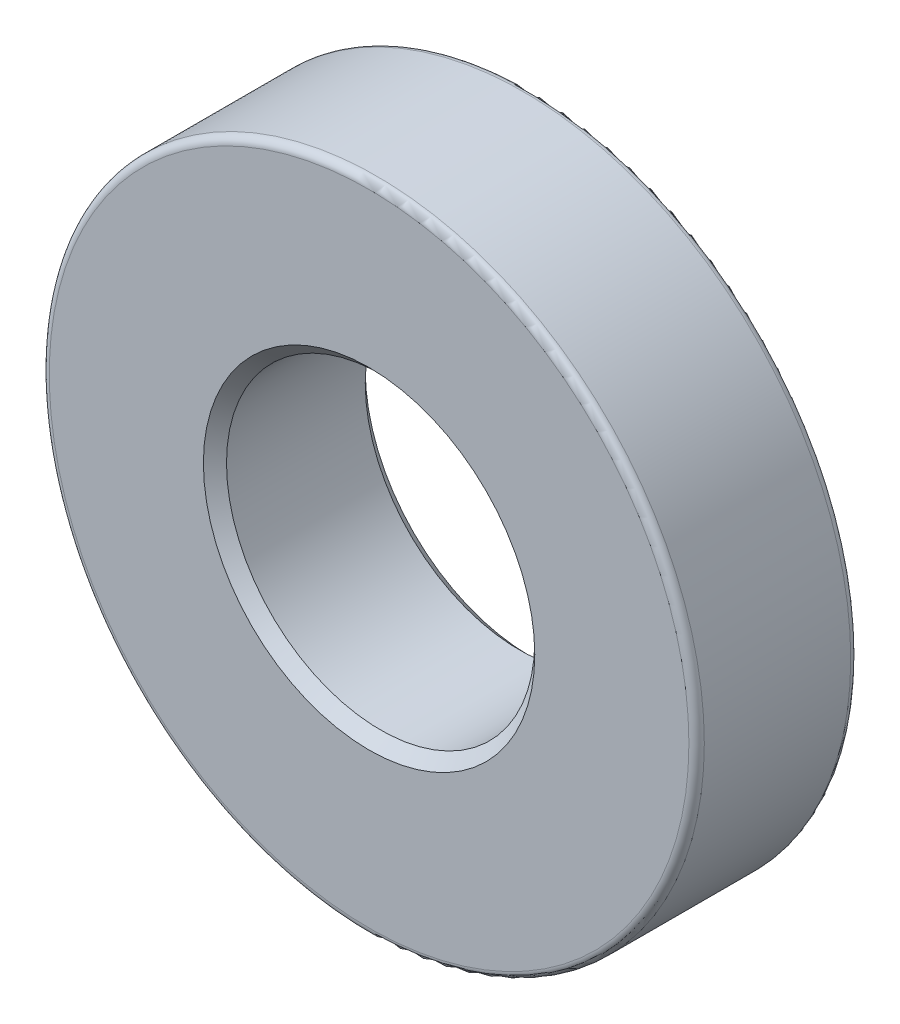
ISO-10303-21;
HEADER;
FILE_DESCRIPTION(('STEP AP214'),'2;1');
FILE_NAME('part.step','',(''),(''),'','','');
FILE_SCHEMA(('AUTOMOTIVE_DESIGN { 1 0 10303 214 1 1 1 1 }'));
ENDSEC;
DATA;
#1=APPLICATION_CONTEXT('core data for automotive mechanical design processes');
#2=APPLICATION_PROTOCOL_DEFINITION('international standard','automotive_design',2000,#1);
#3=PRODUCT_CONTEXT('',#1,'mechanical');
#4=PRODUCT('Part','Part','',(#3));
#5=PRODUCT_RELATED_PRODUCT_CATEGORY('part','',(#4));
#6=PRODUCT_DEFINITION_FORMATION('','',#4);
#7=PRODUCT_DEFINITION_CONTEXT('part definition',#1,'design');
#8=PRODUCT_DEFINITION('design','',#6,#7);
#9=PRODUCT_DEFINITION_SHAPE('','',#8);
#10=(LENGTH_UNIT() NAMED_UNIT(*) SI_UNIT(.MILLI.,.METRE.));
#11=(NAMED_UNIT(*) PLANE_ANGLE_UNIT() SI_UNIT($,.RADIAN.));
#12=(NAMED_UNIT(*) SI_UNIT($,.STERADIAN.) SOLID_ANGLE_UNIT());
#13=UNCERTAINTY_MEASURE_WITH_UNIT(LENGTH_MEASURE(1.E-05),#10,'distance_accuracy_value','');
#14=(GEOMETRIC_REPRESENTATION_CONTEXT(3) GLOBAL_UNCERTAINTY_ASSIGNED_CONTEXT((#13)) GLOBAL_UNIT_ASSIGNED_CONTEXT((#10,
#11,#12)) REPRESENTATION_CONTEXT('',''));
#15=CARTESIAN_POINT('',(0.,0.,0.));
#16=DIRECTION('',(0.,0.,1.));
#17=DIRECTION('',(1.,0.,0.));
#18=AXIS2_PLACEMENT_3D('',#15,#16,#17);
#19=CARTESIAN_POINT('',(0.,0.,4.2));
#20=DIRECTION('',(0.,0.,1.));
#21=DIRECTION('',(1.,0.,0.));
#22=AXIS2_PLACEMENT_3D('',#19,#20,#21);
#23=PLANE('',#22);
#24=CARTESIAN_POINT('',(0.,0.,4.2));
#25=DIRECTION('',(0.,0.,1.));
#26=DIRECTION('',(1.,0.,0.));
#27=AXIS2_PLACEMENT_3D('',#24,#25,#26);
#28=CIRCLE('',#27,8.3);
#29=CARTESIAN_POINT('',(8.3,0.,4.2));
#30=VERTEX_POINT('',#29);
#31=EDGE_CURVE('E10',#30,#30,#28,.T.);
#32=ORIENTED_EDGE('',*,*,#31,.T.);
#33=EDGE_LOOP('',(#32));
#34=FACE_BOUND('',#33,.T.);
#35=CARTESIAN_POINT('',(0.,0.,4.2));
#36=DIRECTION('',(0.,0.,1.));
#37=DIRECTION('',(1.,0.,0.));
#38=AXIS2_PLACEMENT_3D('',#35,#36,#37);
#39=CIRCLE('',#38,4.3);
#40=CARTESIAN_POINT('',(4.3,0.,4.2));
#41=VERTEX_POINT('',#40);
#42=EDGE_CURVE('E60',#41,#41,#39,.F.);
#43=ORIENTED_EDGE('',*,*,#42,.T.);
#44=EDGE_LOOP('',(#43));
#45=FACE_BOUND('',#44,.T.);
#46=ADVANCED_FACE('F37',(#34,#45),#23,.T.);
#47=CARTESIAN_POINT('',(0.,0.,0.));
#48=DIRECTION('',(0.,0.,1.));
#49=DIRECTION('',(1.,0.,0.));
#50=AXIS2_PLACEMENT_3D('',#47,#48,#49);
#51=PLANE('',#50);
#52=CARTESIAN_POINT('',(0.,0.,0.));
#53=DIRECTION('',(0.,0.,1.));
#54=DIRECTION('',(1.,0.,0.));
#55=AXIS2_PLACEMENT_3D('',#52,#53,#54);
#56=CIRCLE('',#55,8.3);
#57=CARTESIAN_POINT('',(8.3,0.,0.));
#58=VERTEX_POINT('',#57);
#59=EDGE_CURVE('E44',#58,#58,#56,.F.);
#60=ORIENTED_EDGE('',*,*,#59,.T.);
#61=EDGE_LOOP('',(#60));
#62=FACE_BOUND('',#61,.T.);
#63=CARTESIAN_POINT('',(0.,0.,0.));
#64=DIRECTION('',(0.,0.,1.));
#65=DIRECTION('',(1.,0.,0.));
#66=AXIS2_PLACEMENT_3D('',#63,#64,#65);
#67=CIRCLE('',#66,4.3);
#68=CARTESIAN_POINT('',(-4.3,0.,0.));
#69=VERTEX_POINT('',#68);
#70=EDGE_CURVE('E57',#69,#69,#67,.T.);
#71=ORIENTED_EDGE('',*,*,#70,.T.);
#72=EDGE_LOOP('',(#71));
#73=FACE_BOUND('',#72,.T.);
#74=ADVANCED_FACE('F80',(#62,#73),#51,.F.);
#75=CARTESIAN_POINT('',(0.,0.,4.2));
#76=DIRECTION('',(0.,0.,-1.));
#77=DIRECTION('',(-1.,0.,0.));
#78=AXIS2_PLACEMENT_3D('',#75,#76,#77);
#79=CYLINDRICAL_SURFACE('',#78,8.5);
#80=CARTESIAN_POINT('',(0.,0.,0.2));
#81=DIRECTION('',(0.,0.,1.));
#82=DIRECTION('',(1.,0.,0.));
#83=AXIS2_PLACEMENT_3D('',#80,#81,#82);
#84=CIRCLE('',#83,8.5);
#85=CARTESIAN_POINT('',(8.5,0.,0.2));
#86=VERTEX_POINT('',#85);
#87=EDGE_CURVE('E48',#86,#86,#84,.T.);
#88=ORIENTED_EDGE('',*,*,#87,.T.);
#89=EDGE_LOOP('',(#88));
#90=FACE_BOUND('',#89,.T.);
#91=CARTESIAN_POINT('',(0.,0.,4.));
#92=DIRECTION('',(0.,0.,1.));
#93=DIRECTION('',(1.,0.,0.));
#94=AXIS2_PLACEMENT_3D('',#91,#92,#93);
#95=CIRCLE('',#94,8.5);
#96=CARTESIAN_POINT('',(8.5,0.,4.));
#97=VERTEX_POINT('',#96);
#98=EDGE_CURVE('E52',#97,#97,#95,.F.);
#99=ORIENTED_EDGE('',*,*,#98,.T.);
#100=EDGE_LOOP('',(#99));
#101=FACE_BOUND('',#100,.T.);
#102=ADVANCED_FACE('F82',(#90,#101),#79,.T.);
#103=CARTESIAN_POINT('',(0.,0.,4.2));
#104=DIRECTION('',(0.,0.,-1.));
#105=DIRECTION('',(-1.,0.,0.));
#106=AXIS2_PLACEMENT_3D('',#103,#104,#105);
#107=CYLINDRICAL_SURFACE('',#106,4.);
#108=CARTESIAN_POINT('',(0.,0.,3.9));
#109=DIRECTION('',(0.,0.,1.));
#110=DIRECTION('',(1.,0.,0.));
#111=AXIS2_PLACEMENT_3D('',#108,#109,#110);
#112=CIRCLE('',#111,4.);
#113=CARTESIAN_POINT('',(4.,0.,3.9));
#114=VERTEX_POINT('',#113);
#115=EDGE_CURVE('E63',#114,#114,#112,.T.);
#116=ORIENTED_EDGE('',*,*,#115,.T.);
#117=EDGE_LOOP('',(#116));
#118=FACE_BOUND('',#117,.T.);
#119=CARTESIAN_POINT('',(0.,0.,0.300000000000005));
#120=DIRECTION('',(0.,0.,1.));
#121=DIRECTION('',(1.,0.,0.));
#122=AXIS2_PLACEMENT_3D('',#119,#120,#121);
#123=CIRCLE('',#122,4.);
#124=CARTESIAN_POINT('',(-4.,0.,0.300000000000005));
#125=VERTEX_POINT('',#124);
#126=EDGE_CURVE('E66',#125,#125,#123,.F.);
#127=ORIENTED_EDGE('',*,*,#126,.T.);
#128=EDGE_LOOP('',(#127));
#129=FACE_BOUND('',#128,.T.);
#130=ADVANCED_FACE('F70',(#118,#129),#107,.F.);
#131=CARTESIAN_POINT('',(0.,0.,3.9));
#132=DIRECTION('',(0.,0.,1.));
#133=DIRECTION('',(1.,0.,0.));
#134=AXIS2_PLACEMENT_3D('',#131,#132,#133);
#135=CONICAL_SURFACE('',#134,4.,0.785398163397445);
#136=ORIENTED_EDGE('',*,*,#42,.F.);
#137=EDGE_LOOP('',(#136));
#138=FACE_BOUND('',#137,.T.);
#139=ORIENTED_EDGE('',*,*,#115,.F.);
#140=EDGE_LOOP('',(#139));
#141=FACE_BOUND('',#140,.T.);
#142=ADVANCED_FACE('F76',(#138,#141),#135,.F.);
#143=CARTESIAN_POINT('',(0.,0.,0.));
#144=DIRECTION('',(0.,0.,-1.));
#145=DIRECTION('',(-1.,0.,0.));
#146=AXIS2_PLACEMENT_3D('',#143,#144,#145);
#147=CONICAL_SURFACE('',#146,4.3,0.785398163397445);
#148=CARTESIAN_POINT('',(-4.,0.,0.300000000000005));
#149=CARTESIAN_POINT('',(-4.003125,0.,0.296875000000005));
#150=CARTESIAN_POINT('',(-4.00625,0.,0.293750000000005));
#151=CARTESIAN_POINT('',(-4.0125,0.,0.287500000000005));
#152=CARTESIAN_POINT('',(-4.015625,0.,0.284375000000005));
#153=CARTESIAN_POINT('',(-4.021875,0.,0.278125000000005));
#154=CARTESIAN_POINT('',(-4.025,0.,0.275000000000005));
#155=CARTESIAN_POINT('',(-4.03125,0.,0.268750000000004));
#156=CARTESIAN_POINT('',(-4.034375,0.,0.265625000000004));
#157=CARTESIAN_POINT('',(-4.040625,0.,0.259375000000004));
#158=CARTESIAN_POINT('',(-4.04375,0.,0.256250000000004));
#159=CARTESIAN_POINT('',(-4.05,0.,0.250000000000004));
#160=CARTESIAN_POINT('',(-4.053125,0.,0.246875000000004));
#161=CARTESIAN_POINT('',(-4.059375,0.,0.240625000000004));
#162=CARTESIAN_POINT('',(-4.0625,0.,0.237500000000004));
#163=CARTESIAN_POINT('',(-4.06875,0.,0.231250000000004));
#164=CARTESIAN_POINT('',(-4.071875,0.,0.228125000000004));
#165=CARTESIAN_POINT('',(-4.078125,0.,0.221875000000004));
#166=CARTESIAN_POINT('',(-4.08125,0.,0.218750000000004));
#167=CARTESIAN_POINT('',(-4.0875,0.,0.212500000000004));
#168=CARTESIAN_POINT('',(-4.090625,0.,0.209375000000004));
#169=CARTESIAN_POINT('',(-4.096875,0.,0.203125000000003));
#170=CARTESIAN_POINT('',(-4.1,0.,0.200000000000003));
#171=CARTESIAN_POINT('',(-4.10625,0.,0.193750000000003));
#172=CARTESIAN_POINT('',(-4.109375,0.,0.190625000000003));
#173=CARTESIAN_POINT('',(-4.115625,0.,0.184375000000003));
#174=CARTESIAN_POINT('',(-4.11875,0.,0.181250000000003));
#175=CARTESIAN_POINT('',(-4.125,0.,0.175000000000003));
#176=CARTESIAN_POINT('',(-4.128125,0.,0.171875000000003));
#177=CARTESIAN_POINT('',(-4.134375,0.,0.165625000000003));
#178=CARTESIAN_POINT('',(-4.1375,0.,0.162500000000003));
#179=CARTESIAN_POINT('',(-4.14375,0.,0.156250000000003));
#180=CARTESIAN_POINT('',(-4.146875,0.,0.153125000000003));
#181=CARTESIAN_POINT('',(-4.153125,0.,0.146875000000002));
#182=CARTESIAN_POINT('',(-4.15625,0.,0.143750000000002));
#183=CARTESIAN_POINT('',(-4.1625,0.,0.137500000000002));
#184=CARTESIAN_POINT('',(-4.165625,0.,0.134375000000002));
#185=CARTESIAN_POINT('',(-4.171875,0.,0.128125000000002));
#186=CARTESIAN_POINT('',(-4.175,0.,0.125000000000002));
#187=CARTESIAN_POINT('',(-4.18125,0.,0.118750000000002));
#188=CARTESIAN_POINT('',(-4.184375,0.,0.115625000000002));
#189=CARTESIAN_POINT('',(-4.190625,0.,0.109375000000002));
#190=CARTESIAN_POINT('',(-4.19375,0.,0.106250000000002));
#191=CARTESIAN_POINT('',(-4.2,0.,0.100000000000002));
#192=CARTESIAN_POINT('',(-4.203125,0.,0.0968750000000017));
#193=CARTESIAN_POINT('',(-4.209375,0.,0.0906250000000015));
#194=CARTESIAN_POINT('',(-4.2125,0.,0.0875000000000014));
#195=CARTESIAN_POINT('',(-4.21875,0.,0.0812500000000013));
#196=CARTESIAN_POINT('',(-4.221875,0.,0.0781250000000014));
#197=CARTESIAN_POINT('',(-4.228125,0.,0.0718750000000013));
#198=CARTESIAN_POINT('',(-4.23125,0.,0.0687500000000012));
#199=CARTESIAN_POINT('',(-4.2375,0.,0.062500000000001));
#200=CARTESIAN_POINT('',(-4.240625,0.,0.059375000000001));
#201=CARTESIAN_POINT('',(-4.246875,0.,0.0531250000000009));
#202=CARTESIAN_POINT('',(-4.25,0.,0.0500000000000008));
#203=CARTESIAN_POINT('',(-4.25625,0.,0.0437500000000007));
#204=CARTESIAN_POINT('',(-4.259375,0.,0.0406250000000007));
#205=CARTESIAN_POINT('',(-4.265625,0.,0.0343750000000007));
#206=CARTESIAN_POINT('',(-4.26875,0.,0.0312500000000006));
#207=CARTESIAN_POINT('',(-4.275,0.,0.0250000000000004));
#208=CARTESIAN_POINT('',(-4.278125,0.,0.0218750000000003));
#209=CARTESIAN_POINT('',(-4.284375,0.,0.0156250000000002));
#210=CARTESIAN_POINT('',(-4.2875,0.,0.0125000000000002));
#211=CARTESIAN_POINT('',(-4.29375,0.,0.00625000000000024));
#212=CARTESIAN_POINT('',(-4.296875,0.,0.00312500000000025));
#213=CARTESIAN_POINT('',(-4.3,0.,0.));
#214=B_SPLINE_CURVE_WITH_KNOTS('',3,(#148,#149,#150,#151,#152,#153,#154,#155,#156,#157,#158,
#159,#160,#161,#162,#163,#164,#165,#166,#167,#168,#169,#170,#171,#172,#173,#174,#175,#176,#177,
#178,#179,#180,#181,#182,#183,#184,#185,#186,#187,#188,#189,#190,#191,#192,#193,#194,#195,#196,
#197,#198,#199,#200,#201,#202,#203,#204,#205,#206,#207,#208,#209,#210,#211,#212,#213),
.UNSPECIFIED.,.F.,.F.,(4,2,2,2,2,2,2,2,2,2,2,2,2,2,2,2,2,2,2,2,2,2,2,2,2,2,2,2,2,2,2,2,4),(0.,
0.0132582521472478,0.0265165042944961,0.0397747564417439,0.0530330085889917,0.06629126073624,
0.0795495128834878,0.0928077650307355,0.106066017177983,0.119324269325232,0.132582521472479,
0.145840773619727,0.159099025766976,0.172357277914223,0.185615530061471,0.198873782208719,
0.212132034355967,0.225390286503215,0.238648538650463,0.251906790797711,0.265165042944959,
0.278423295092207,0.291681547239455,0.304939799386703,0.318198051533951,0.331456303681199,
0.344714555828447,0.357972807975695,0.371231060122943,0.384489312270191,0.397747564417439,
0.411005816564687,0.424264068711935),.UNSPECIFIED.);
#215=EDGE_CURVE('BSEAM72',#125,#69,#214,.T.);
#216=ORIENTED_EDGE('',*,*,#126,.F.);
#217=ORIENTED_EDGE('',*,*,#70,.F.);
#218=ORIENTED_EDGE('',*,*,#215,.T.);
#219=ORIENTED_EDGE('',*,*,#215,.F.);
#220=EDGE_LOOP('',(#216,#218,#217,#219));
#221=FACE_BOUND('',#220,.T.);
#222=ADVANCED_FACE('F72',(#221),#147,.F.);
#223=CARTESIAN_POINT('',(0.,0.,0.2));
#224=DIRECTION('',(0.,0.,1.));
#225=DIRECTION('',(1.,0.,0.));
#226=AXIS2_PLACEMENT_3D('',#223,#224,#225);
#227=TOROIDAL_SURFACE('',#226,8.3,0.2);
#228=ORIENTED_EDGE('',*,*,#59,.F.);
#229=EDGE_LOOP('',(#228));
#230=FACE_BOUND('',#229,.T.);
#231=ORIENTED_EDGE('',*,*,#87,.F.);
#232=EDGE_LOOP('',(#231));
#233=FACE_BOUND('',#232,.T.);
#234=ADVANCED_FACE('F75',(#230,#233),#227,.T.);
#235=CARTESIAN_POINT('',(0.,0.,4.));
#236=DIRECTION('',(0.,0.,1.));
#237=DIRECTION('',(1.,0.,0.));
#238=AXIS2_PLACEMENT_3D('',#235,#236,#237);
#239=TOROIDAL_SURFACE('',#238,8.3,0.2);
#240=ORIENTED_EDGE('',*,*,#98,.F.);
#241=EDGE_LOOP('',(#240));
#242=FACE_BOUND('',#241,.T.);
#243=ORIENTED_EDGE('',*,*,#31,.F.);
#244=EDGE_LOOP('',(#243));
#245=FACE_BOUND('',#244,.T.);
#246=ADVANCED_FACE('F39',(#242,#245),#239,.T.);
#247=CLOSED_SHELL('',(#46,#74,#102,#130,#142,#222,#234,#246));
#248=MANIFOLD_SOLID_BREP('B2',#247);
#249=ADVANCED_BREP_SHAPE_REPRESENTATION('',(#18,#248),#14);
#250=SHAPE_DEFINITION_REPRESENTATION(#9,#249);
ENDSEC;
END-ISO-10303-21;
